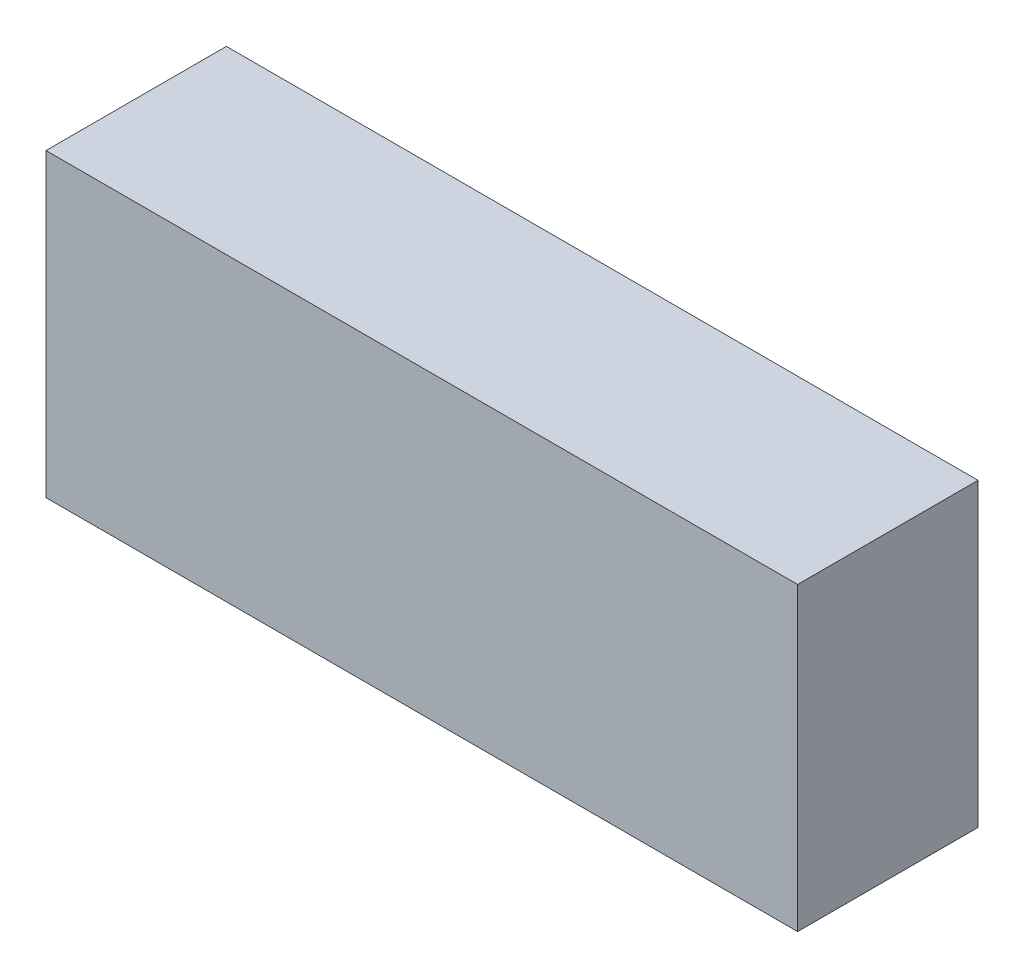
ISO-10303-21;
HEADER;
FILE_DESCRIPTION(('STEP AP214'),'2;1');
FILE_NAME('part.step','',(''),(''),'','','');
FILE_SCHEMA(('AUTOMOTIVE_DESIGN { 1 0 10303 214 1 1 1 1 }'));
ENDSEC;
DATA;
#1=APPLICATION_CONTEXT('core data for automotive mechanical design processes');
#2=APPLICATION_PROTOCOL_DEFINITION('international standard','automotive_design',2000,#1);
#3=PRODUCT_CONTEXT('',#1,'mechanical');
#4=PRODUCT('Part','Part','',(#3));
#5=PRODUCT_RELATED_PRODUCT_CATEGORY('part','',(#4));
#6=PRODUCT_DEFINITION_FORMATION('','',#4);
#7=PRODUCT_DEFINITION_CONTEXT('part definition',#1,'design');
#8=PRODUCT_DEFINITION('design','',#6,#7);
#9=PRODUCT_DEFINITION_SHAPE('','',#8);
#10=(LENGTH_UNIT() NAMED_UNIT(*) SI_UNIT(.MILLI.,.METRE.));
#11=(NAMED_UNIT(*) PLANE_ANGLE_UNIT() SI_UNIT($,.RADIAN.));
#12=(NAMED_UNIT(*) SI_UNIT($,.STERADIAN.) SOLID_ANGLE_UNIT());
#13=UNCERTAINTY_MEASURE_WITH_UNIT(LENGTH_MEASURE(1.E-05),#10,'distance_accuracy_value','');
#14=(GEOMETRIC_REPRESENTATION_CONTEXT(3) GLOBAL_UNCERTAINTY_ASSIGNED_CONTEXT((#13)) GLOBAL_UNIT_ASSIGNED_CONTEXT((#10,
#11,#12)) REPRESENTATION_CONTEXT('',''));
#15=CARTESIAN_POINT('',(0.,0.,0.));
#16=DIRECTION('',(0.,0.,1.));
#17=DIRECTION('',(1.,0.,0.));
#18=AXIS2_PLACEMENT_3D('',#15,#16,#17);
#19=CARTESIAN_POINT('',(12.5,-5.,6.));
#20=DIRECTION('',(-1.,0.,0.));
#21=DIRECTION('',(0.,0.,1.));
#22=AXIS2_PLACEMENT_3D('',#19,#20,#21);
#23=PLANE('',#22);
#24=DIRECTION('',(0.,1.,0.));
#25=VECTOR('',#24,1.);
#26=CARTESIAN_POINT('',(12.5,-5.,0.));
#27=LINE('',#26,#25);
#28=CARTESIAN_POINT('',(12.5,-5.,0.));
#29=VERTEX_POINT('',#28);
#30=CARTESIAN_POINT('',(12.5,5.,0.));
#31=VERTEX_POINT('',#30);
#32=EDGE_CURVE('E107',#29,#31,#27,.T.);
#33=ORIENTED_EDGE('',*,*,#32,.T.);
#34=DIRECTION('',(0.,0.,-1.));
#35=VECTOR('',#34,1.);
#36=CARTESIAN_POINT('',(12.5,5.,6.));
#37=LINE('',#36,#35);
#38=CARTESIAN_POINT('',(12.5,5.,6.));
#39=VERTEX_POINT('',#38);
#40=EDGE_CURVE('E11',#39,#31,#37,.T.);
#41=ORIENTED_EDGE('',*,*,#40,.F.);
#42=DIRECTION('',(0.,1.,0.));
#43=VECTOR('',#42,1.);
#44=CARTESIAN_POINT('',(12.5,-5.,6.));
#45=LINE('',#44,#43);
#46=CARTESIAN_POINT('',(12.5,-5.,6.));
#47=VERTEX_POINT('',#46);
#48=EDGE_CURVE('E89',#47,#39,#45,.T.);
#49=ORIENTED_EDGE('',*,*,#48,.F.);
#50=DIRECTION('',(0.,0.,-1.));
#51=VECTOR('',#50,1.);
#52=CARTESIAN_POINT('',(12.5,-5.,6.));
#53=LINE('',#52,#51);
#54=EDGE_CURVE('E56',#47,#29,#53,.T.);
#55=ORIENTED_EDGE('',*,*,#54,.T.);
#56=EDGE_LOOP('',(#33,#41,#49,#55));
#57=FACE_BOUND('',#56,.T.);
#58=ADVANCED_FACE('F39',(#57),#23,.F.);
#59=CARTESIAN_POINT('',(12.5,5.,6.));
#60=DIRECTION('',(0.,-1.,0.));
#61=DIRECTION('',(1.,0.,0.));
#62=AXIS2_PLACEMENT_3D('',#59,#60,#61);
#63=PLANE('',#62);
#64=DIRECTION('',(-1.,0.,0.));
#65=VECTOR('',#64,1.);
#66=CARTESIAN_POINT('',(12.5,5.,0.));
#67=LINE('',#66,#65);
#68=CARTESIAN_POINT('',(-12.5,4.99999999999999,0.));
#69=VERTEX_POINT('',#68);
#70=EDGE_CURVE('E95',#31,#69,#67,.T.);
#71=ORIENTED_EDGE('',*,*,#70,.T.);
#72=DIRECTION('',(0.,0.,-1.));
#73=VECTOR('',#72,1.);
#74=CARTESIAN_POINT('',(-12.5,4.99999999999999,6.));
#75=LINE('',#74,#73);
#76=CARTESIAN_POINT('',(-12.5,4.99999999999999,6.));
#77=VERTEX_POINT('',#76);
#78=EDGE_CURVE('E48',#77,#69,#75,.T.);
#79=ORIENTED_EDGE('',*,*,#78,.F.);
#80=DIRECTION('',(-1.,0.,0.));
#81=VECTOR('',#80,1.);
#82=CARTESIAN_POINT('',(12.5,5.,6.));
#83=LINE('',#82,#81);
#84=EDGE_CURVE('E81',#39,#77,#83,.T.);
#85=ORIENTED_EDGE('',*,*,#84,.F.);
#86=ORIENTED_EDGE('',*,*,#40,.T.);
#87=EDGE_LOOP('',(#71,#79,#85,#86));
#88=FACE_BOUND('',#87,.T.);
#89=ADVANCED_FACE('F94',(#88),#63,.F.);
#90=CARTESIAN_POINT('',(-12.5,-5.00000000000001,6.));
#91=DIRECTION('',(-1.,0.,0.));
#92=DIRECTION('',(0.,0.,1.));
#93=AXIS2_PLACEMENT_3D('',#90,#91,#92);
#94=PLANE('',#93);
#95=DIRECTION('',(0.,1.,0.));
#96=VECTOR('',#95,1.);
#97=CARTESIAN_POINT('',(-12.5,-5.00000000000001,0.));
#98=LINE('',#97,#96);
#99=CARTESIAN_POINT('',(-12.5,-5.00000000000001,0.));
#100=VERTEX_POINT('',#99);
#101=EDGE_CURVE('E112',#100,#69,#98,.T.);
#102=ORIENTED_EDGE('',*,*,#101,.F.);
#103=DIRECTION('',(0.,0.,-1.));
#104=VECTOR('',#103,1.);
#105=CARTESIAN_POINT('',(-12.5,-5.00000000000001,6.));
#106=LINE('',#105,#104);
#107=CARTESIAN_POINT('',(-12.5,-5.00000000000001,6.));
#108=VERTEX_POINT('',#107);
#109=EDGE_CURVE('E70',#108,#100,#106,.T.);
#110=ORIENTED_EDGE('',*,*,#109,.F.);
#111=DIRECTION('',(0.,1.,0.));
#112=VECTOR('',#111,1.);
#113=CARTESIAN_POINT('',(-12.5,-5.00000000000001,6.));
#114=LINE('',#113,#112);
#115=EDGE_CURVE('E88',#108,#77,#114,.T.);
#116=ORIENTED_EDGE('',*,*,#115,.T.);
#117=ORIENTED_EDGE('',*,*,#78,.T.);
#118=EDGE_LOOP('',(#102,#110,#116,#117));
#119=FACE_BOUND('',#118,.T.);
#120=ADVANCED_FACE('F99',(#119),#94,.T.);
#121=CARTESIAN_POINT('',(12.5,-5.,6.));
#122=DIRECTION('',(0.,-1.,0.));
#123=DIRECTION('',(1.,0.,0.));
#124=AXIS2_PLACEMENT_3D('',#121,#122,#123);
#125=PLANE('',#124);
#126=DIRECTION('',(-1.,0.,0.));
#127=VECTOR('',#126,1.);
#128=CARTESIAN_POINT('',(12.5,-5.,0.));
#129=LINE('',#128,#127);
#130=EDGE_CURVE('E115',#29,#100,#129,.T.);
#131=ORIENTED_EDGE('',*,*,#130,.F.);
#132=ORIENTED_EDGE('',*,*,#54,.F.);
#133=DIRECTION('',(-1.,0.,0.));
#134=VECTOR('',#133,1.);
#135=CARTESIAN_POINT('',(12.5,-5.,6.));
#136=LINE('',#135,#134);
#137=EDGE_CURVE('E101',#47,#108,#136,.T.);
#138=ORIENTED_EDGE('',*,*,#137,.T.);
#139=ORIENTED_EDGE('',*,*,#109,.T.);
#140=EDGE_LOOP('',(#131,#132,#138,#139));
#141=FACE_BOUND('',#140,.T.);
#142=ADVANCED_FACE('F125',(#141),#125,.T.);
#143=CARTESIAN_POINT('',(0.,0.,6.));
#144=DIRECTION('',(0.,0.,1.));
#145=DIRECTION('',(1.,0.,0.));
#146=AXIS2_PLACEMENT_3D('',#143,#144,#145);
#147=PLANE('',#146);
#148=ORIENTED_EDGE('',*,*,#48,.T.);
#149=ORIENTED_EDGE('',*,*,#84,.T.);
#150=ORIENTED_EDGE('',*,*,#115,.F.);
#151=ORIENTED_EDGE('',*,*,#137,.F.);
#152=EDGE_LOOP('',(#148,#149,#150,#151));
#153=FACE_BOUND('',#152,.T.);
#154=ADVANCED_FACE('F85',(#153),#147,.T.);
#155=CARTESIAN_POINT('',(0.,0.,0.));
#156=DIRECTION('',(0.,0.,1.));
#157=DIRECTION('',(1.,0.,0.));
#158=AXIS2_PLACEMENT_3D('',#155,#156,#157);
#159=PLANE('',#158);
#160=ORIENTED_EDGE('',*,*,#32,.F.);
#161=ORIENTED_EDGE('',*,*,#130,.T.);
#162=ORIENTED_EDGE('',*,*,#101,.T.);
#163=ORIENTED_EDGE('',*,*,#70,.F.);
#164=EDGE_LOOP('',(#160,#161,#162,#163));
#165=FACE_BOUND('',#164,.T.);
#166=ADVANCED_FACE('F124',(#165),#159,.F.);
#167=CLOSED_SHELL('',(#58,#89,#120,#142,#154,#166));
#168=MANIFOLD_SOLID_BREP('B2',#167);
#169=ADVANCED_BREP_SHAPE_REPRESENTATION('',(#18,#168),#14);
#170=SHAPE_DEFINITION_REPRESENTATION(#9,#169);
ENDSEC;
END-ISO-10303-21;
